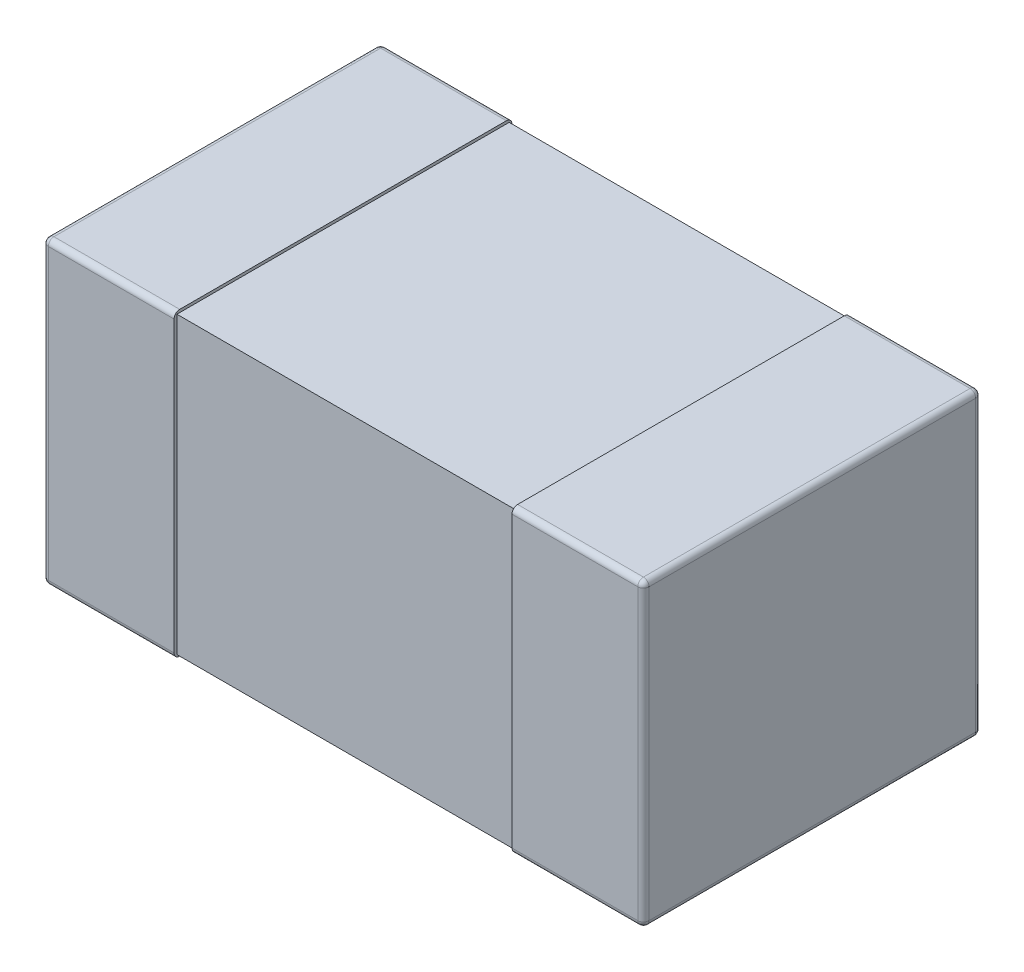
ISO-10303-21;
HEADER;
FILE_DESCRIPTION(('STEP AP214'),'2;1');
FILE_NAME('part.step','',(''),(''),'','','');
FILE_SCHEMA(('AUTOMOTIVE_DESIGN { 1 0 10303 214 1 1 1 1 }'));
ENDSEC;
DATA;
#1=APPLICATION_CONTEXT('core data for automotive mechanical design processes');
#2=APPLICATION_PROTOCOL_DEFINITION('international standard','automotive_design',2000,#1);
#3=PRODUCT_CONTEXT('',#1,'mechanical');
#4=PRODUCT('Part','Part','',(#3));
#5=PRODUCT_RELATED_PRODUCT_CATEGORY('part','',(#4));
#6=PRODUCT_DEFINITION_FORMATION('','',#4);
#7=PRODUCT_DEFINITION_CONTEXT('part definition',#1,'design');
#8=PRODUCT_DEFINITION('design','',#6,#7);
#9=PRODUCT_DEFINITION_SHAPE('','',#8);
#10=(LENGTH_UNIT() NAMED_UNIT(*) SI_UNIT(.MILLI.,.METRE.));
#11=(NAMED_UNIT(*) PLANE_ANGLE_UNIT() SI_UNIT($,.RADIAN.));
#12=(NAMED_UNIT(*) SI_UNIT($,.STERADIAN.) SOLID_ANGLE_UNIT());
#13=UNCERTAINTY_MEASURE_WITH_UNIT(LENGTH_MEASURE(1.E-05),#10,'distance_accuracy_value','');
#14=(GEOMETRIC_REPRESENTATION_CONTEXT(3) GLOBAL_UNCERTAINTY_ASSIGNED_CONTEXT((#13)) GLOBAL_UNIT_ASSIGNED_CONTEXT((#10,
#11,#12)) REPRESENTATION_CONTEXT('',''));
#15=CARTESIAN_POINT('',(0.,0.,0.));
#16=DIRECTION('',(0.,0.,1.));
#17=DIRECTION('',(1.,0.,0.));
#18=AXIS2_PLACEMENT_3D('',#15,#16,#17);
#19=CARTESIAN_POINT('',(-0.8,0.,0.));
#20=DIRECTION('',(-1.,0.,0.));
#21=DIRECTION('',(0.,0.,1.));
#22=AXIS2_PLACEMENT_3D('',#19,#20,#21);
#23=PLANE('',#22);
#24=DIRECTION('',(0.,1.,0.));
#25=VECTOR('',#24,1.);
#26=CARTESIAN_POINT('',(-0.8,0.,0.015));
#27=LINE('',#26,#25);
#28=CARTESIAN_POINT('',(-0.8,-0.385,0.0150000000000001));
#29=VERTEX_POINT('',#28);
#30=CARTESIAN_POINT('',(-0.8,0.385,0.0149999999999999));
#31=VERTEX_POINT('',#30);
#32=EDGE_CURVE('P0_E178',#29,#31,#27,.T.);
#33=ORIENTED_EDGE('',*,*,#32,.F.);
#34=DIRECTION('',(0.,0.,-1.));
#35=VECTOR('',#34,1.);
#36=CARTESIAN_POINT('',(-0.8,-0.385,0.));
#37=LINE('',#36,#35);
#38=CARTESIAN_POINT('',(-0.8,-0.385,0.885));
#39=VERTEX_POINT('',#38);
#40=EDGE_CURVE('P0_E108',#39,#29,#37,.T.);
#41=ORIENTED_EDGE('',*,*,#40,.F.);
#42=DIRECTION('',(0.,-1.,0.));
#43=VECTOR('',#42,1.);
#44=CARTESIAN_POINT('',(-0.8,0.,0.885));
#45=LINE('',#44,#43);
#46=CARTESIAN_POINT('',(-0.8,0.385,0.885));
#47=VERTEX_POINT('',#46);
#48=EDGE_CURVE('P0_E103',#47,#39,#45,.T.);
#49=ORIENTED_EDGE('',*,*,#48,.F.);
#50=DIRECTION('',(0.,0.,1.));
#51=VECTOR('',#50,1.);
#52=CARTESIAN_POINT('',(-0.8,0.385,0.));
#53=LINE('',#52,#51);
#54=EDGE_CURVE('P0_E106',#31,#47,#53,.T.);
#55=ORIENTED_EDGE('',*,*,#54,.F.);
#56=EDGE_LOOP('',(#33,#41,#49,#55));
#57=FACE_BOUND('',#56,.T.);
#58=ADVANCED_FACE('P0_F18',(#57),#23,.T.);
#59=CARTESIAN_POINT('',(-0.785,-0.385,0.885));
#60=DIRECTION('',(1.,0.,0.));
#61=DIRECTION('',(0.,0.,-1.));
#62=AXIS2_PLACEMENT_3D('',#59,#60,#61);
#63=SPHERICAL_SURFACE('',#62,0.015);
#64=CARTESIAN_POINT('',(-0.785,-0.385,0.885));
#65=DIRECTION('',(0.,-1.,0.));
#66=DIRECTION('',(0.,0.,-1.));
#67=AXIS2_PLACEMENT_3D('',#64,#65,#66);
#68=CIRCLE('',#67,0.015);
#69=CARTESIAN_POINT('',(-0.785,-0.385,0.9));
#70=VERTEX_POINT('',#69);
#71=EDGE_CURVE('P0_E112',#39,#70,#68,.F.);
#72=ORIENTED_EDGE('',*,*,#71,.F.);
#73=CARTESIAN_POINT('',(-0.785,-0.385,0.885));
#74=DIRECTION('',(0.,0.,-1.));
#75=DIRECTION('',(0.,1.,0.));
#76=AXIS2_PLACEMENT_3D('',#73,#74,#75);
#77=CIRCLE('',#76,0.015);
#78=CARTESIAN_POINT('',(-0.785,-0.4,0.885));
#79=VERTEX_POINT('',#78);
#80=EDGE_CURVE('P0_E175',#79,#39,#77,.T.);
#81=ORIENTED_EDGE('',*,*,#80,.F.);
#82=CARTESIAN_POINT('',(-0.785,-0.385,0.885));
#83=DIRECTION('',(1.,0.,0.));
#84=DIRECTION('',(0.,0.,-1.));
#85=AXIS2_PLACEMENT_3D('',#82,#83,#84);
#86=CIRCLE('',#85,0.015);
#87=EDGE_CURVE('P0_E256',#70,#79,#86,.T.);
#88=ORIENTED_EDGE('',*,*,#87,.F.);
#89=EDGE_LOOP('',(#72,#81,#88));
#90=FACE_BOUND('',#89,.T.);
#91=ADVANCED_FACE('P0_F164',(#90),#63,.T.);
#92=CARTESIAN_POINT('',(-0.785,0.,0.885));
#93=DIRECTION('',(0.,-1.,0.));
#94=DIRECTION('',(0.,0.,-1.));
#95=AXIS2_PLACEMENT_3D('',#92,#93,#94);
#96=CYLINDRICAL_SURFACE('',#95,0.015);
#97=ORIENTED_EDGE('',*,*,#71,.T.);
#98=DIRECTION('',(0.,1.,0.));
#99=VECTOR('',#98,1.);
#100=CARTESIAN_POINT('',(-0.785,0.4,0.9));
#101=LINE('',#100,#99);
#102=CARTESIAN_POINT('',(-0.785,0.385,0.9));
#103=VERTEX_POINT('',#102);
#104=EDGE_CURVE('P0_E118',#70,#103,#101,.T.);
#105=ORIENTED_EDGE('',*,*,#104,.T.);
#106=CARTESIAN_POINT('',(-0.785,0.385,0.885));
#107=DIRECTION('',(0.,-1.,0.));
#108=DIRECTION('',(1.,0.,0.));
#109=AXIS2_PLACEMENT_3D('',#106,#107,#108);
#110=CIRCLE('',#109,0.015);
#111=EDGE_CURVE('P0_E115',#47,#103,#110,.F.);
#112=ORIENTED_EDGE('',*,*,#111,.F.);
#113=ORIENTED_EDGE('',*,*,#48,.T.);
#114=EDGE_LOOP('',(#97,#105,#112,#113));
#115=FACE_BOUND('',#114,.T.);
#116=ADVANCED_FACE('P0_F116',(#115),#96,.T.);
#117=CARTESIAN_POINT('',(-0.785,0.385,0.885));
#118=DIRECTION('',(1.,0.,0.));
#119=DIRECTION('',(0.,0.,-1.));
#120=AXIS2_PLACEMENT_3D('',#117,#118,#119);
#121=SPHERICAL_SURFACE('',#120,0.015);
#122=CARTESIAN_POINT('',(-0.785,0.385,0.885));
#123=DIRECTION('',(1.,0.,0.));
#124=DIRECTION('',(0.,0.,-1.));
#125=AXIS2_PLACEMENT_3D('',#122,#123,#124);
#126=CIRCLE('',#125,0.015);
#127=CARTESIAN_POINT('',(-0.785,0.4,0.885));
#128=VERTEX_POINT('',#127);
#129=EDGE_CURVE('P0_E135',#128,#103,#126,.T.);
#130=ORIENTED_EDGE('',*,*,#129,.F.);
#131=CARTESIAN_POINT('',(-0.785,0.385,0.885));
#132=DIRECTION('',(0.,0.,1.));
#133=DIRECTION('',(1.,0.,0.));
#134=AXIS2_PLACEMENT_3D('',#131,#132,#133);
#135=CIRCLE('',#134,0.015);
#136=EDGE_CURVE('P0_E125',#47,#128,#135,.F.);
#137=ORIENTED_EDGE('',*,*,#136,.F.);
#138=ORIENTED_EDGE('',*,*,#111,.T.);
#139=EDGE_LOOP('',(#130,#137,#138));
#140=FACE_BOUND('',#139,.T.);
#141=ADVANCED_FACE('P0_F134',(#140),#121,.T.);
#142=CARTESIAN_POINT('',(-0.785,0.385,0.));
#143=DIRECTION('',(0.,0.,1.));
#144=DIRECTION('',(1.,0.,0.));
#145=AXIS2_PLACEMENT_3D('',#142,#143,#144);
#146=CYLINDRICAL_SURFACE('',#145,0.015);
#147=CARTESIAN_POINT('',(-0.785,0.385,0.0149999999999999));
#148=DIRECTION('',(0.,3.19361374222152E-13,1.));
#149=DIRECTION('',(1.,0.,0.));
#150=AXIS2_PLACEMENT_3D('',#147,#148,#149);
#151=CIRCLE('',#150,0.015);
#152=CARTESIAN_POINT('',(-0.785,0.4,0.0149999999999987));
#153=VERTEX_POINT('',#152);
#154=EDGE_CURVE('P0_E130',#31,#153,#151,.F.);
#155=ORIENTED_EDGE('',*,*,#154,.F.);
#156=ORIENTED_EDGE('',*,*,#54,.T.);
#157=ORIENTED_EDGE('',*,*,#136,.T.);
#158=DIRECTION('',(0.,0.,-1.));
#159=VECTOR('',#158,1.);
#160=CARTESIAN_POINT('',(-0.785,0.4,0.));
#161=LINE('',#160,#159);
#162=EDGE_CURVE('P0_E246',#128,#153,#161,.T.);
#163=ORIENTED_EDGE('',*,*,#162,.T.);
#164=EDGE_LOOP('',(#155,#156,#157,#163));
#165=FACE_BOUND('',#164,.T.);
#166=ADVANCED_FACE('P0_F128',(#165),#146,.T.);
#167=CARTESIAN_POINT('',(-0.785,0.385,0.0149999999999999));
#168=DIRECTION('',(1.,0.,0.));
#169=DIRECTION('',(0.,0.,-1.));
#170=AXIS2_PLACEMENT_3D('',#167,#168,#169);
#171=SPHERICAL_SURFACE('',#170,0.015);
#172=CARTESIAN_POINT('',(-0.785,0.385,0.0149999999999999));
#173=DIRECTION('',(1.,0.,0.));
#174=DIRECTION('',(0.,0.,-1.));
#175=AXIS2_PLACEMENT_3D('',#172,#173,#174);
#176=CIRCLE('',#175,0.015);
#177=CARTESIAN_POINT('',(-0.785,0.385,0.));
#178=VERTEX_POINT('',#177);
#179=EDGE_CURVE('P0_E240',#178,#153,#176,.T.);
#180=ORIENTED_EDGE('',*,*,#179,.F.);
#181=CARTESIAN_POINT('',(-0.785,0.385,0.0149999999999999));
#182=DIRECTION('',(0.,1.,0.));
#183=DIRECTION('',(0.,0.,1.));
#184=AXIS2_PLACEMENT_3D('',#181,#182,#183);
#185=CIRCLE('',#184,0.015);
#186=EDGE_CURVE('P0_E182',#31,#178,#185,.F.);
#187=ORIENTED_EDGE('',*,*,#186,.F.);
#188=ORIENTED_EDGE('',*,*,#154,.T.);
#189=EDGE_LOOP('',(#180,#187,#188));
#190=FACE_BOUND('',#189,.T.);
#191=ADVANCED_FACE('P0_F298',(#190),#171,.T.);
#192=CARTESIAN_POINT('',(-0.785,0.,0.015));
#193=DIRECTION('',(0.,1.,0.));
#194=DIRECTION('',(0.,0.,1.));
#195=AXIS2_PLACEMENT_3D('',#192,#193,#194);
#196=CYLINDRICAL_SURFACE('',#195,0.015);
#197=CARTESIAN_POINT('',(-0.785,-0.385,0.0150000000000001));
#198=DIRECTION('',(0.,1.,0.));
#199=DIRECTION('',(1.,0.,0.));
#200=AXIS2_PLACEMENT_3D('',#197,#198,#199);
#201=CIRCLE('',#200,0.015);
#202=CARTESIAN_POINT('',(-0.785,-0.385,0.));
#203=VERTEX_POINT('',#202);
#204=EDGE_CURVE('P0_E181',#29,#203,#201,.F.);
#205=ORIENTED_EDGE('',*,*,#204,.F.);
#206=ORIENTED_EDGE('',*,*,#32,.T.);
#207=ORIENTED_EDGE('',*,*,#186,.T.);
#208=DIRECTION('',(0.,-1.,0.));
#209=VECTOR('',#208,1.);
#210=CARTESIAN_POINT('',(-0.785,0.4,0.));
#211=LINE('',#210,#209);
#212=EDGE_CURVE('P0_E234',#178,#203,#211,.T.);
#213=ORIENTED_EDGE('',*,*,#212,.T.);
#214=EDGE_LOOP('',(#205,#206,#207,#213));
#215=FACE_BOUND('',#214,.T.);
#216=ADVANCED_FACE('P0_F294',(#215),#196,.T.);
#217=CARTESIAN_POINT('',(-0.785,-0.385,0.0150000000000001));
#218=DIRECTION('',(1.,0.,0.));
#219=DIRECTION('',(0.,0.,-1.));
#220=AXIS2_PLACEMENT_3D('',#217,#218,#219);
#221=SPHERICAL_SURFACE('',#220,0.015);
#222=ORIENTED_EDGE('',*,*,#204,.T.);
#223=CARTESIAN_POINT('',(-0.785,-0.385,0.0150000000000001));
#224=DIRECTION('',(1.,0.,0.));
#225=DIRECTION('',(0.,0.,-1.));
#226=AXIS2_PLACEMENT_3D('',#223,#224,#225);
#227=CIRCLE('',#226,0.015);
#228=CARTESIAN_POINT('',(-0.785,-0.4,0.0150000000000001));
#229=VERTEX_POINT('',#228);
#230=EDGE_CURVE('P0_E227',#229,#203,#227,.T.);
#231=ORIENTED_EDGE('',*,*,#230,.F.);
#232=CARTESIAN_POINT('',(-0.785,-0.385,0.0150000000000001));
#233=DIRECTION('',(0.,0.,-1.));
#234=DIRECTION('',(0.,1.,0.));
#235=AXIS2_PLACEMENT_3D('',#232,#233,#234);
#236=CIRCLE('',#235,0.015);
#237=EDGE_CURVE('P0_E68',#29,#229,#236,.F.);
#238=ORIENTED_EDGE('',*,*,#237,.F.);
#239=EDGE_LOOP('',(#222,#231,#238));
#240=FACE_BOUND('',#239,.T.);
#241=ADVANCED_FACE('P0_F289',(#240),#221,.T.);
#242=CARTESIAN_POINT('',(-0.785,-0.385,0.));
#243=DIRECTION('',(0.,0.,-1.));
#244=DIRECTION('',(0.,1.,0.));
#245=AXIS2_PLACEMENT_3D('',#242,#243,#244);
#246=CYLINDRICAL_SURFACE('',#245,0.015);
#247=ORIENTED_EDGE('',*,*,#237,.T.);
#248=DIRECTION('',(0.,0.,1.));
#249=VECTOR('',#248,1.);
#250=CARTESIAN_POINT('',(-0.785,-0.4,0.));
#251=LINE('',#250,#249);
#252=EDGE_CURVE('P0_E212',#229,#79,#251,.T.);
#253=ORIENTED_EDGE('',*,*,#252,.T.);
#254=ORIENTED_EDGE('',*,*,#80,.T.);
#255=ORIENTED_EDGE('',*,*,#40,.T.);
#256=EDGE_LOOP('',(#247,#253,#254,#255));
#257=FACE_BOUND('',#256,.T.);
#258=ADVANCED_FACE('P0_F293',(#257),#246,.T.);
#259=CARTESIAN_POINT('',(-0.8,-0.385,0.885));
#260=DIRECTION('',(1.,0.,0.));
#261=DIRECTION('',(0.,0.,-1.));
#262=AXIS2_PLACEMENT_3D('',#259,#260,#261);
#263=CYLINDRICAL_SURFACE('',#262,0.015);
#264=ORIENTED_EDGE('',*,*,#87,.T.);
#265=DIRECTION('',(1.,0.,0.));
#266=VECTOR('',#265,1.);
#267=CARTESIAN_POINT('',(-0.8,-0.4,0.885));
#268=LINE('',#267,#266);
#269=CARTESIAN_POINT('',(-0.45,-0.4,0.885));
#270=VERTEX_POINT('',#269);
#271=EDGE_CURVE('P0_E217',#79,#270,#268,.T.);
#272=ORIENTED_EDGE('',*,*,#271,.T.);
#273=CARTESIAN_POINT('',(-0.45,-0.385,0.885));
#274=DIRECTION('',(1.,0.,0.));
#275=DIRECTION('',(0.,0.,-1.));
#276=AXIS2_PLACEMENT_3D('',#273,#274,#275);
#277=CIRCLE('',#276,0.015);
#278=CARTESIAN_POINT('',(-0.45,-0.385,0.9));
#279=VERTEX_POINT('',#278);
#280=EDGE_CURVE('P0_E21',#270,#279,#277,.F.);
#281=ORIENTED_EDGE('',*,*,#280,.T.);
#282=DIRECTION('',(1.,0.,0.));
#283=VECTOR('',#282,1.);
#284=CARTESIAN_POINT('',(-0.8,-0.385,0.9));
#285=LINE('',#284,#283);
#286=EDGE_CURVE('P0_E153',#279,#70,#285,.F.);
#287=ORIENTED_EDGE('',*,*,#286,.T.);
#288=EDGE_LOOP('',(#264,#272,#281,#287));
#289=FACE_BOUND('',#288,.T.);
#290=ADVANCED_FACE('P0_F420',(#289),#263,.T.);
#291=CARTESIAN_POINT('',(-0.8,0.4,0.9));
#292=DIRECTION('',(0.,0.,-1.));
#293=DIRECTION('',(0.,1.,0.));
#294=AXIS2_PLACEMENT_3D('',#291,#292,#293);
#295=PLANE('',#294);
#296=DIRECTION('',(1.,0.,0.));
#297=VECTOR('',#296,1.);
#298=CARTESIAN_POINT('',(-0.8,0.385,0.9));
#299=LINE('',#298,#297);
#300=CARTESIAN_POINT('',(-0.45,0.385,0.9));
#301=VERTEX_POINT('',#300);
#302=EDGE_CURVE('P0_E148',#103,#301,#299,.T.);
#303=ORIENTED_EDGE('',*,*,#302,.F.);
#304=ORIENTED_EDGE('',*,*,#104,.F.);
#305=ORIENTED_EDGE('',*,*,#286,.F.);
#306=DIRECTION('',(0.,1.,0.));
#307=VECTOR('',#306,1.);
#308=CARTESIAN_POINT('',(-0.45,0.,0.9));
#309=LINE('',#308,#307);
#310=EDGE_CURVE('P0_E200',#279,#301,#309,.T.);
#311=ORIENTED_EDGE('',*,*,#310,.T.);
#312=EDGE_LOOP('',(#303,#304,#305,#311));
#313=FACE_BOUND('',#312,.T.);
#314=ADVANCED_FACE('P0_F411',(#313),#295,.F.);
#315=CARTESIAN_POINT('',(-0.8,0.385,0.885));
#316=DIRECTION('',(1.,0.,0.));
#317=DIRECTION('',(0.,0.,-1.));
#318=AXIS2_PLACEMENT_3D('',#315,#316,#317);
#319=CYLINDRICAL_SURFACE('',#318,0.015);
#320=CARTESIAN_POINT('',(-0.45,0.385,0.885));
#321=DIRECTION('',(1.,0.,0.));
#322=DIRECTION('',(0.,0.,-1.));
#323=AXIS2_PLACEMENT_3D('',#320,#321,#322);
#324=CIRCLE('',#323,0.015);
#325=CARTESIAN_POINT('',(-0.45,0.4,0.885));
#326=VERTEX_POINT('',#325);
#327=EDGE_CURVE('P0_E197',#301,#326,#324,.F.);
#328=ORIENTED_EDGE('',*,*,#327,.T.);
#329=DIRECTION('',(1.,0.,0.));
#330=VECTOR('',#329,1.);
#331=CARTESIAN_POINT('',(-0.8,0.4,0.885));
#332=LINE('',#331,#330);
#333=EDGE_CURVE('P0_E243',#326,#128,#332,.F.);
#334=ORIENTED_EDGE('',*,*,#333,.T.);
#335=ORIENTED_EDGE('',*,*,#129,.T.);
#336=ORIENTED_EDGE('',*,*,#302,.T.);
#337=EDGE_LOOP('',(#328,#334,#335,#336));
#338=FACE_BOUND('',#337,.T.);
#339=ADVANCED_FACE('P0_F402',(#338),#319,.T.);
#340=CARTESIAN_POINT('',(-0.8,0.4,0.));
#341=DIRECTION('',(0.,-1.,0.));
#342=DIRECTION('',(0.,0.,-1.));
#343=AXIS2_PLACEMENT_3D('',#340,#341,#342);
#344=PLANE('',#343);
#345=DIRECTION('',(1.,0.,0.));
#346=VECTOR('',#345,1.);
#347=CARTESIAN_POINT('',(-0.8,0.4,0.0149999999999999));
#348=LINE('',#347,#346);
#349=CARTESIAN_POINT('',(-0.45,0.4,0.0149999999999999));
#350=VERTEX_POINT('',#349);
#351=EDGE_CURVE('P0_E235',#153,#350,#348,.T.);
#352=ORIENTED_EDGE('',*,*,#351,.F.);
#353=ORIENTED_EDGE('',*,*,#162,.F.);
#354=ORIENTED_EDGE('',*,*,#333,.F.);
#355=DIRECTION('',(0.,0.,1.));
#356=VECTOR('',#355,1.);
#357=CARTESIAN_POINT('',(-0.45,0.4,0.));
#358=LINE('',#357,#356);
#359=EDGE_CURVE('P0_E196',#326,#350,#358,.F.);
#360=ORIENTED_EDGE('',*,*,#359,.T.);
#361=EDGE_LOOP('',(#352,#353,#354,#360));
#362=FACE_BOUND('',#361,.T.);
#363=ADVANCED_FACE('P0_F323',(#362),#344,.F.);
#364=CARTESIAN_POINT('',(-0.8,0.385,0.0149999999999999));
#365=DIRECTION('',(1.,0.,0.));
#366=DIRECTION('',(0.,0.,-1.));
#367=AXIS2_PLACEMENT_3D('',#364,#365,#366);
#368=CYLINDRICAL_SURFACE('',#367,0.015);
#369=ORIENTED_EDGE('',*,*,#179,.T.);
#370=ORIENTED_EDGE('',*,*,#351,.T.);
#371=CARTESIAN_POINT('',(-0.45,0.385,0.0149999999999999));
#372=DIRECTION('',(1.,0.,0.));
#373=DIRECTION('',(0.,0.,-1.));
#374=AXIS2_PLACEMENT_3D('',#371,#372,#373);
#375=CIRCLE('',#374,0.015);
#376=CARTESIAN_POINT('',(-0.45,0.385,0.));
#377=VERTEX_POINT('',#376);
#378=EDGE_CURVE('P0_E193',#350,#377,#375,.F.);
#379=ORIENTED_EDGE('',*,*,#378,.T.);
#380=DIRECTION('',(1.,0.,0.));
#381=VECTOR('',#380,1.);
#382=CARTESIAN_POINT('',(-0.8,0.385,0.));
#383=LINE('',#382,#381);
#384=EDGE_CURVE('P0_E230',#377,#178,#383,.F.);
#385=ORIENTED_EDGE('',*,*,#384,.T.);
#386=EDGE_LOOP('',(#369,#370,#379,#385));
#387=FACE_BOUND('',#386,.T.);
#388=ADVANCED_FACE('P0_F327',(#387),#368,.T.);
#389=CARTESIAN_POINT('',(-0.8,0.4,0.));
#390=DIRECTION('',(0.,0.,1.));
#391=DIRECTION('',(0.,-1.,0.));
#392=AXIS2_PLACEMENT_3D('',#389,#390,#391);
#393=PLANE('',#392);
#394=DIRECTION('',(1.,0.,0.));
#395=VECTOR('',#394,1.);
#396=CARTESIAN_POINT('',(-0.8,-0.385,0.));
#397=LINE('',#396,#395);
#398=CARTESIAN_POINT('',(-0.45,-0.385,0.));
#399=VERTEX_POINT('',#398);
#400=EDGE_CURVE('P0_E222',#203,#399,#397,.T.);
#401=ORIENTED_EDGE('',*,*,#400,.F.);
#402=ORIENTED_EDGE('',*,*,#212,.F.);
#403=ORIENTED_EDGE('',*,*,#384,.F.);
#404=DIRECTION('',(0.,1.,0.));
#405=VECTOR('',#404,1.);
#406=CARTESIAN_POINT('',(-0.45,0.,0.));
#407=LINE('',#406,#405);
#408=EDGE_CURVE('P0_E192',#377,#399,#407,.F.);
#409=ORIENTED_EDGE('',*,*,#408,.T.);
#410=EDGE_LOOP('',(#401,#402,#403,#409));
#411=FACE_BOUND('',#410,.T.);
#412=ADVANCED_FACE('P0_F337',(#411),#393,.F.);
#413=CARTESIAN_POINT('',(-0.8,-0.385,0.0150000000000001));
#414=DIRECTION('',(1.,0.,0.));
#415=DIRECTION('',(0.,0.,-1.));
#416=AXIS2_PLACEMENT_3D('',#413,#414,#415);
#417=CYLINDRICAL_SURFACE('',#416,0.015);
#418=CARTESIAN_POINT('',(-0.45,-0.385,0.0150000000000001));
#419=DIRECTION('',(1.,0.,0.));
#420=DIRECTION('',(0.,0.,-1.));
#421=AXIS2_PLACEMENT_3D('',#418,#419,#420);
#422=CIRCLE('',#421,0.015);
#423=CARTESIAN_POINT('',(-0.45,-0.4,0.0150000000000001));
#424=VERTEX_POINT('',#423);
#425=EDGE_CURVE('P0_E28',#399,#424,#422,.F.);
#426=ORIENTED_EDGE('',*,*,#425,.T.);
#427=DIRECTION('',(1.,0.,0.));
#428=VECTOR('',#427,1.);
#429=CARTESIAN_POINT('',(-0.8,-0.4,0.0150000000000001));
#430=LINE('',#429,#428);
#431=EDGE_CURVE('P0_E36',#424,#229,#430,.F.);
#432=ORIENTED_EDGE('',*,*,#431,.T.);
#433=ORIENTED_EDGE('',*,*,#230,.T.);
#434=ORIENTED_EDGE('',*,*,#400,.T.);
#435=EDGE_LOOP('',(#426,#432,#433,#434));
#436=FACE_BOUND('',#435,.T.);
#437=ADVANCED_FACE('P0_F345',(#436),#417,.T.);
#438=CARTESIAN_POINT('',(-0.8,-0.4,0.));
#439=DIRECTION('',(0.,1.,0.));
#440=DIRECTION('',(0.,0.,1.));
#441=AXIS2_PLACEMENT_3D('',#438,#439,#440);
#442=PLANE('',#441);
#443=ORIENTED_EDGE('',*,*,#431,.F.);
#444=DIRECTION('',(0.,0.,1.));
#445=VECTOR('',#444,1.);
#446=CARTESIAN_POINT('',(-0.45,-0.4,0.));
#447=LINE('',#446,#445);
#448=EDGE_CURVE('P0_E11',#424,#270,#447,.T.);
#449=ORIENTED_EDGE('',*,*,#448,.T.);
#450=ORIENTED_EDGE('',*,*,#271,.F.);
#451=ORIENTED_EDGE('',*,*,#252,.F.);
#452=EDGE_LOOP('',(#443,#449,#450,#451));
#453=FACE_BOUND('',#452,.T.);
#454=ADVANCED_FACE('P0_F343',(#453),#442,.F.);
#455=CARTESIAN_POINT('',(-0.45,0.,0.));
#456=DIRECTION('',(-1.,0.,0.));
#457=DIRECTION('',(0.,0.,1.));
#458=AXIS2_PLACEMENT_3D('',#455,#456,#457);
#459=PLANE('',#458);
#460=ORIENTED_EDGE('',*,*,#425,.F.);
#461=ORIENTED_EDGE('',*,*,#408,.F.);
#462=ORIENTED_EDGE('',*,*,#378,.F.);
#463=ORIENTED_EDGE('',*,*,#359,.F.);
#464=ORIENTED_EDGE('',*,*,#327,.F.);
#465=ORIENTED_EDGE('',*,*,#310,.F.);
#466=ORIENTED_EDGE('',*,*,#280,.F.);
#467=ORIENTED_EDGE('',*,*,#448,.F.);
#468=EDGE_LOOP('',(#460,#461,#462,#463,#464,#465,#466,#467));
#469=FACE_BOUND('',#468,.T.);
#470=ADVANCED_FACE('P0_F330',(#469),#459,.F.);
#471=CLOSED_SHELL('',(#58,#91,#116,#141,#166,#191,#216,#241,#258,#290,#314,#339,#363,#388,#412,
#437,#454,#470));
#472=MANIFOLD_SOLID_BREP('P0_B1',#471);
#473=CARTESIAN_POINT('',(-0.45,0.3925,0.));
#474=DIRECTION('',(0.,-1.,0.));
#475=DIRECTION('',(0.,0.,-1.));
#476=AXIS2_PLACEMENT_3D('',#473,#474,#475);
#477=PLANE('',#476);
#478=DIRECTION('',(-1.,0.,0.));
#479=VECTOR('',#478,1.);
#480=CARTESIAN_POINT('',(-0.45,0.3925,0.8925));
#481=LINE('',#480,#479);
#482=CARTESIAN_POINT('',(-0.45,0.3925,0.8925));
#483=VERTEX_POINT('',#482);
#484=CARTESIAN_POINT('',(0.45,0.3925,0.8925));
#485=VERTEX_POINT('',#484);
#486=EDGE_CURVE('P1_E53',#483,#485,#481,.F.);
#487=ORIENTED_EDGE('',*,*,#486,.T.);
#488=DIRECTION('',(0.,0.,1.));
#489=VECTOR('',#488,1.);
#490=CARTESIAN_POINT('',(0.45,0.3925,0.9));
#491=LINE('',#490,#489);
#492=CARTESIAN_POINT('',(0.45,0.3925,0.0075));
#493=VERTEX_POINT('',#492);
#494=EDGE_CURVE('P1_E68',#485,#493,#491,.F.);
#495=ORIENTED_EDGE('',*,*,#494,.T.);
#496=DIRECTION('',(1.,0.,0.));
#497=VECTOR('',#496,1.);
#498=CARTESIAN_POINT('',(-0.45,0.3925,0.0075));
#499=LINE('',#498,#497);
#500=CARTESIAN_POINT('',(-0.45,0.3925,0.0075));
#501=VERTEX_POINT('',#500);
#502=EDGE_CURVE('P1_E20',#493,#501,#499,.F.);
#503=ORIENTED_EDGE('',*,*,#502,.T.);
#504=DIRECTION('',(0.,0.,-1.));
#505=VECTOR('',#504,1.);
#506=CARTESIAN_POINT('',(-0.45,0.3925,0.9));
#507=LINE('',#506,#505);
#508=EDGE_CURVE('P1_E58',#501,#483,#507,.F.);
#509=ORIENTED_EDGE('',*,*,#508,.T.);
#510=EDGE_LOOP('',(#487,#495,#503,#509));
#511=FACE_BOUND('',#510,.T.);
#512=ADVANCED_FACE('P1_F17',(#511),#477,.F.);
#513=CARTESIAN_POINT('',(-0.45,0.4,0.0075));
#514=DIRECTION('',(0.,0.,1.));
#515=DIRECTION('',(1.,0.,0.));
#516=AXIS2_PLACEMENT_3D('',#513,#514,#515);
#517=PLANE('',#516);
#518=DIRECTION('',(1.,0.,0.));
#519=VECTOR('',#518,1.);
#520=CARTESIAN_POINT('',(-0.45,-0.3925,0.0075));
#521=LINE('',#520,#519);
#522=CARTESIAN_POINT('',(0.45,-0.3925,0.0075));
#523=VERTEX_POINT('',#522);
#524=CARTESIAN_POINT('',(-0.45,-0.3925,0.0075));
#525=VERTEX_POINT('',#524);
#526=EDGE_CURVE('P1_E74',#523,#525,#521,.F.);
#527=ORIENTED_EDGE('',*,*,#526,.T.);
#528=DIRECTION('',(0.,1.,0.));
#529=VECTOR('',#528,1.);
#530=CARTESIAN_POINT('',(-0.45,-0.4,0.00750000000000002));
#531=LINE('',#530,#529);
#532=EDGE_CURVE('P1_E63',#525,#501,#531,.T.);
#533=ORIENTED_EDGE('',*,*,#532,.T.);
#534=ORIENTED_EDGE('',*,*,#502,.F.);
#535=DIRECTION('',(0.,1.,0.));
#536=VECTOR('',#535,1.);
#537=CARTESIAN_POINT('',(0.45,-0.4,0.00750000000000002));
#538=LINE('',#537,#536);
#539=EDGE_CURVE('P1_E80',#493,#523,#538,.F.);
#540=ORIENTED_EDGE('',*,*,#539,.T.);
#541=EDGE_LOOP('',(#527,#533,#534,#540));
#542=FACE_BOUND('',#541,.T.);
#543=ADVANCED_FACE('P1_F73',(#542),#517,.F.);
#544=CARTESIAN_POINT('',(-0.45,-0.4,0.9));
#545=DIRECTION('',(1.,0.,0.));
#546=DIRECTION('',(0.,0.,-1.));
#547=AXIS2_PLACEMENT_3D('',#544,#545,#546);
#548=PLANE('',#547);
#549=DIRECTION('',(0.,0.,1.));
#550=VECTOR('',#549,1.);
#551=CARTESIAN_POINT('',(-0.45,-0.3925,0.));
#552=LINE('',#551,#550);
#553=CARTESIAN_POINT('',(-0.45,-0.3925,0.8925));
#554=VERTEX_POINT('',#553);
#555=EDGE_CURVE('P1_E84',#525,#554,#552,.T.);
#556=ORIENTED_EDGE('',*,*,#555,.T.);
#557=DIRECTION('',(0.,1.,0.));
#558=VECTOR('',#557,1.);
#559=CARTESIAN_POINT('',(-0.45,0.4,0.8925));
#560=LINE('',#559,#558);
#561=EDGE_CURVE('P1_E65',#554,#483,#560,.T.);
#562=ORIENTED_EDGE('',*,*,#561,.T.);
#563=ORIENTED_EDGE('',*,*,#508,.F.);
#564=ORIENTED_EDGE('',*,*,#532,.F.);
#565=EDGE_LOOP('',(#556,#562,#563,#564));
#566=FACE_BOUND('',#565,.T.);
#567=ADVANCED_FACE('P1_F61',(#566),#548,.F.);
#568=CARTESIAN_POINT('',(-0.45,0.4,0.8925));
#569=DIRECTION('',(0.,0.,-1.));
#570=DIRECTION('',(-1.,0.,0.));
#571=AXIS2_PLACEMENT_3D('',#568,#569,#570);
#572=PLANE('',#571);
#573=DIRECTION('',(1.,0.,0.));
#574=VECTOR('',#573,1.);
#575=CARTESIAN_POINT('',(-0.45,-0.3925,0.8925));
#576=LINE('',#575,#574);
#577=CARTESIAN_POINT('',(0.45,-0.3925,0.8925));
#578=VERTEX_POINT('',#577);
#579=EDGE_CURVE('P1_E26',#554,#578,#576,.T.);
#580=ORIENTED_EDGE('',*,*,#579,.T.);
#581=DIRECTION('',(0.,1.,0.));
#582=VECTOR('',#581,1.);
#583=CARTESIAN_POINT('',(0.45,-0.4,0.8925));
#584=LINE('',#583,#582);
#585=EDGE_CURVE('P1_E34',#578,#485,#584,.T.);
#586=ORIENTED_EDGE('',*,*,#585,.T.);
#587=ORIENTED_EDGE('',*,*,#486,.F.);
#588=ORIENTED_EDGE('',*,*,#561,.F.);
#589=EDGE_LOOP('',(#580,#586,#587,#588));
#590=FACE_BOUND('',#589,.T.);
#591=ADVANCED_FACE('P1_F88',(#590),#572,.F.);
#592=CARTESIAN_POINT('',(0.45,-0.4,0.9));
#593=DIRECTION('',(-1.,0.,0.));
#594=DIRECTION('',(0.,0.,1.));
#595=AXIS2_PLACEMENT_3D('',#592,#593,#594);
#596=PLANE('',#595);
#597=DIRECTION('',(0.,0.,1.));
#598=VECTOR('',#597,1.);
#599=CARTESIAN_POINT('',(0.45,-0.3925,0.));
#600=LINE('',#599,#598);
#601=EDGE_CURVE('P1_E11',#578,#523,#600,.F.);
#602=ORIENTED_EDGE('',*,*,#601,.T.);
#603=ORIENTED_EDGE('',*,*,#539,.F.);
#604=ORIENTED_EDGE('',*,*,#494,.F.);
#605=ORIENTED_EDGE('',*,*,#585,.F.);
#606=EDGE_LOOP('',(#602,#603,#604,#605));
#607=FACE_BOUND('',#606,.T.);
#608=ADVANCED_FACE('P1_F91',(#607),#596,.F.);
#609=CARTESIAN_POINT('',(-0.45,-0.3925,0.));
#610=DIRECTION('',(0.,1.,0.));
#611=DIRECTION('',(0.,0.,1.));
#612=AXIS2_PLACEMENT_3D('',#609,#610,#611);
#613=PLANE('',#612);
#614=ORIENTED_EDGE('',*,*,#579,.F.);
#615=ORIENTED_EDGE('',*,*,#555,.F.);
#616=ORIENTED_EDGE('',*,*,#526,.F.);
#617=ORIENTED_EDGE('',*,*,#601,.F.);
#618=EDGE_LOOP('',(#614,#615,#616,#617));
#619=FACE_BOUND('',#618,.T.);
#620=ADVANCED_FACE('P1_F90',(#619),#613,.F.);
#621=CLOSED_SHELL('',(#512,#543,#567,#591,#608,#620));
#622=MANIFOLD_SOLID_BREP('P1_B1',#621);
#623=CARTESIAN_POINT('',(0.8,0.,0.));
#624=DIRECTION('',(1.,0.,0.));
#625=DIRECTION('',(0.,0.,-1.));
#626=AXIS2_PLACEMENT_3D('',#623,#624,#625);
#627=PLANE('',#626);
#628=DIRECTION('',(0.,0.,-1.));
#629=VECTOR('',#628,1.);
#630=CARTESIAN_POINT('',(0.8,0.385,0.));
#631=LINE('',#630,#629);
#632=CARTESIAN_POINT('',(0.8,0.385,0.885));
#633=VERTEX_POINT('',#632);
#634=CARTESIAN_POINT('',(0.8,0.385,0.015));
#635=VERTEX_POINT('',#634);
#636=EDGE_CURVE('P2_E93',#633,#635,#631,.T.);
#637=ORIENTED_EDGE('',*,*,#636,.F.);
#638=DIRECTION('',(0.,1.,0.));
#639=VECTOR('',#638,1.);
#640=CARTESIAN_POINT('',(0.8,0.,0.885));
#641=LINE('',#640,#639);
#642=CARTESIAN_POINT('',(0.8,-0.385,0.885));
#643=VERTEX_POINT('',#642);
#644=EDGE_CURVE('P2_E96',#643,#633,#641,.T.);
#645=ORIENTED_EDGE('',*,*,#644,.F.);
#646=DIRECTION('',(0.,0.,1.));
#647=VECTOR('',#646,1.);
#648=CARTESIAN_POINT('',(0.8,-0.385,0.));
#649=LINE('',#648,#647);
#650=CARTESIAN_POINT('',(0.8,-0.385,0.0149999999999999));
#651=VERTEX_POINT('',#650);
#652=EDGE_CURVE('P2_E99',#651,#643,#649,.T.);
#653=ORIENTED_EDGE('',*,*,#652,.F.);
#654=DIRECTION('',(0.,-1.,0.));
#655=VECTOR('',#654,1.);
#656=CARTESIAN_POINT('',(0.8,0.,0.015));
#657=LINE('',#656,#655);
#658=EDGE_CURVE('P2_E116',#635,#651,#657,.T.);
#659=ORIENTED_EDGE('',*,*,#658,.F.);
#660=EDGE_LOOP('',(#637,#645,#653,#659));
#661=FACE_BOUND('',#660,.T.);
#662=ADVANCED_FACE('P2_F17',(#661),#627,.T.);
#663=CARTESIAN_POINT('',(0.785,0.385,0.015));
#664=DIRECTION('',(1.,0.,0.));
#665=DIRECTION('',(0.,0.,-1.));
#666=AXIS2_PLACEMENT_3D('',#663,#664,#665);
#667=SPHERICAL_SURFACE('',#666,0.015);
#668=CARTESIAN_POINT('',(0.785,0.385,0.015));
#669=DIRECTION('',(0.,0.,-1.));
#670=DIRECTION('',(-1.,0.,0.));
#671=AXIS2_PLACEMENT_3D('',#668,#669,#670);
#672=CIRCLE('',#671,0.015);
#673=CARTESIAN_POINT('',(0.785,0.4,0.015));
#674=VERTEX_POINT('',#673);
#675=EDGE_CURVE('P2_E263',#635,#674,#672,.F.);
#676=ORIENTED_EDGE('',*,*,#675,.F.);
#677=CARTESIAN_POINT('',(0.785,0.385,0.015));
#678=DIRECTION('',(0.,-1.,0.));
#679=DIRECTION('',(0.,0.,-1.));
#680=AXIS2_PLACEMENT_3D('',#677,#678,#679);
#681=CIRCLE('',#680,0.015);
#682=CARTESIAN_POINT('',(0.785,0.385,0.));
#683=VERTEX_POINT('',#682);
#684=EDGE_CURVE('P2_E188',#683,#635,#681,.T.);
#685=ORIENTED_EDGE('',*,*,#684,.F.);
#686=CARTESIAN_POINT('',(0.785,0.385,0.015));
#687=DIRECTION('',(-1.,0.,0.));
#688=DIRECTION('',(0.,0.,1.));
#689=AXIS2_PLACEMENT_3D('',#686,#687,#688);
#690=CIRCLE('',#689,0.015);
#691=EDGE_CURVE('P2_E119',#674,#683,#690,.T.);
#692=ORIENTED_EDGE('',*,*,#691,.F.);
#693=EDGE_LOOP('',(#676,#685,#692));
#694=FACE_BOUND('',#693,.T.);
#695=ADVANCED_FACE('P2_F243',(#694),#667,.T.);
#696=CARTESIAN_POINT('',(0.785,0.385,0.));
#697=DIRECTION('',(0.,0.,-1.));
#698=DIRECTION('',(-1.,0.,0.));
#699=AXIS2_PLACEMENT_3D('',#696,#697,#698);
#700=CYLINDRICAL_SURFACE('',#699,0.015);
#701=ORIENTED_EDGE('',*,*,#675,.T.);
#702=DIRECTION('',(0.,0.,-1.));
#703=VECTOR('',#702,1.);
#704=CARTESIAN_POINT('',(0.785,0.4,0.9));
#705=LINE('',#704,#703);
#706=CARTESIAN_POINT('',(0.785,0.4,0.885));
#707=VERTEX_POINT('',#706);
#708=EDGE_CURVE('P2_E176',#674,#707,#705,.F.);
#709=ORIENTED_EDGE('',*,*,#708,.T.);
#710=CARTESIAN_POINT('',(0.785,0.385,0.885));
#711=DIRECTION('',(0.,0.,1.));
#712=DIRECTION('',(1.,0.,0.));
#713=AXIS2_PLACEMENT_3D('',#710,#711,#712);
#714=CIRCLE('',#713,0.015);
#715=EDGE_CURVE('P2_E223',#633,#707,#714,.T.);
#716=ORIENTED_EDGE('',*,*,#715,.F.);
#717=ORIENTED_EDGE('',*,*,#636,.T.);
#718=EDGE_LOOP('',(#701,#709,#716,#717));
#719=FACE_BOUND('',#718,.T.);
#720=ADVANCED_FACE('P2_F240',(#719),#700,.T.);
#721=CARTESIAN_POINT('',(0.785,0.385,0.885));
#722=DIRECTION('',(1.,0.,0.));
#723=DIRECTION('',(0.,0.,-1.));
#724=AXIS2_PLACEMENT_3D('',#721,#722,#723);
#725=SPHERICAL_SURFACE('',#724,0.015);
#726=CARTESIAN_POINT('',(0.785,0.385,0.885));
#727=DIRECTION('',(-1.,0.,0.));
#728=DIRECTION('',(0.,0.,1.));
#729=AXIS2_PLACEMENT_3D('',#726,#727,#728);
#730=CIRCLE('',#729,0.015);
#731=CARTESIAN_POINT('',(0.785,0.385,0.9));
#732=VERTEX_POINT('',#731);
#733=EDGE_CURVE('P2_E170',#732,#707,#730,.T.);
#734=ORIENTED_EDGE('',*,*,#733,.F.);
#735=CARTESIAN_POINT('',(0.785,0.385,0.885));
#736=DIRECTION('',(0.,1.,0.));
#737=DIRECTION('',(0.,0.,1.));
#738=AXIS2_PLACEMENT_3D('',#735,#736,#737);
#739=CIRCLE('',#738,0.015);
#740=EDGE_CURVE('P2_E75',#633,#732,#739,.F.);
#741=ORIENTED_EDGE('',*,*,#740,.F.);
#742=ORIENTED_EDGE('',*,*,#715,.T.);
#743=EDGE_LOOP('',(#734,#741,#742));
#744=FACE_BOUND('',#743,.T.);
#745=ADVANCED_FACE('P2_F237',(#744),#725,.T.);
#746=CARTESIAN_POINT('',(0.785,0.,0.885));
#747=DIRECTION('',(0.,1.,0.));
#748=DIRECTION('',(0.,0.,1.));
#749=AXIS2_PLACEMENT_3D('',#746,#747,#748);
#750=CYLINDRICAL_SURFACE('',#749,0.015);
#751=CARTESIAN_POINT('',(0.785,-0.385,0.885));
#752=DIRECTION('',(0.,-1.,0.));
#753=DIRECTION('',(1.,0.,0.));
#754=AXIS2_PLACEMENT_3D('',#751,#752,#753);
#755=CIRCLE('',#754,0.015);
#756=CARTESIAN_POINT('',(0.785,-0.385,0.9));
#757=VERTEX_POINT('',#756);
#758=EDGE_CURVE('P2_E63',#643,#757,#755,.T.);
#759=ORIENTED_EDGE('',*,*,#758,.F.);
#760=ORIENTED_EDGE('',*,*,#644,.T.);
#761=ORIENTED_EDGE('',*,*,#740,.T.);
#762=DIRECTION('',(0.,1.,0.));
#763=VECTOR('',#762,1.);
#764=CARTESIAN_POINT('',(0.785,0.4,0.9));
#765=LINE('',#764,#763);
#766=EDGE_CURVE('P2_E160',#732,#757,#765,.F.);
#767=ORIENTED_EDGE('',*,*,#766,.T.);
#768=EDGE_LOOP('',(#759,#760,#761,#767));
#769=FACE_BOUND('',#768,.T.);
#770=ADVANCED_FACE('P2_F211',(#769),#750,.T.);
#771=CARTESIAN_POINT('',(0.785,-0.385,0.885));
#772=DIRECTION('',(1.,0.,0.));
#773=DIRECTION('',(0.,0.,-1.));
#774=AXIS2_PLACEMENT_3D('',#771,#772,#773);
#775=SPHERICAL_SURFACE('',#774,0.015);
#776=CARTESIAN_POINT('',(0.785,-0.385,0.885));
#777=DIRECTION('',(-1.,0.,0.));
#778=DIRECTION('',(0.,0.,1.));
#779=AXIS2_PLACEMENT_3D('',#776,#777,#778);
#780=CIRCLE('',#779,0.015);
#781=CARTESIAN_POINT('',(0.785,-0.4,0.885));
#782=VERTEX_POINT('',#781);
#783=EDGE_CURVE('P2_E158',#782,#757,#780,.T.);
#784=ORIENTED_EDGE('',*,*,#783,.F.);
#785=CARTESIAN_POINT('',(0.785,-0.385,0.885));
#786=DIRECTION('',(0.,0.,1.));
#787=DIRECTION('',(0.,-1.,0.));
#788=AXIS2_PLACEMENT_3D('',#785,#786,#787);
#789=CIRCLE('',#788,0.015);
#790=EDGE_CURVE('P2_E219',#643,#782,#789,.F.);
#791=ORIENTED_EDGE('',*,*,#790,.F.);
#792=ORIENTED_EDGE('',*,*,#758,.T.);
#793=EDGE_LOOP('',(#784,#791,#792));
#794=FACE_BOUND('',#793,.T.);
#795=ADVANCED_FACE('P2_F206',(#794),#775,.T.);
#796=CARTESIAN_POINT('',(0.785,-0.385,0.));
#797=DIRECTION('',(0.,0.,1.));
#798=DIRECTION('',(0.,-1.,0.));
#799=AXIS2_PLACEMENT_3D('',#796,#797,#798);
#800=CYLINDRICAL_SURFACE('',#799,0.015);
#801=CARTESIAN_POINT('',(0.785,-0.385,0.0149999999999999));
#802=DIRECTION('',(0.,1.5968841852615E-13,-1.));
#803=DIRECTION('',(1.,0.,0.));
#804=AXIS2_PLACEMENT_3D('',#801,#802,#803);
#805=CIRCLE('',#804,0.015);
#806=CARTESIAN_POINT('',(0.785,-0.4,0.0149999999999993));
#807=VERTEX_POINT('',#806);
#808=EDGE_CURVE('P2_E124',#651,#807,#805,.T.);
#809=ORIENTED_EDGE('',*,*,#808,.F.);
#810=ORIENTED_EDGE('',*,*,#652,.T.);
#811=ORIENTED_EDGE('',*,*,#790,.T.);
#812=DIRECTION('',(0.,0.,1.));
#813=VECTOR('',#812,1.);
#814=CARTESIAN_POINT('',(0.785,-0.4,0.9));
#815=LINE('',#814,#813);
#816=EDGE_CURVE('P2_E128',#782,#807,#815,.F.);
#817=ORIENTED_EDGE('',*,*,#816,.T.);
#818=EDGE_LOOP('',(#809,#810,#811,#817));
#819=FACE_BOUND('',#818,.T.);
#820=ADVANCED_FACE('P2_F202',(#819),#800,.T.);
#821=CARTESIAN_POINT('',(0.785,-0.385,0.0149999999999999));
#822=DIRECTION('',(1.,0.,0.));
#823=DIRECTION('',(0.,0.,-1.));
#824=AXIS2_PLACEMENT_3D('',#821,#822,#823);
#825=SPHERICAL_SURFACE('',#824,0.015);
#826=ORIENTED_EDGE('',*,*,#808,.T.);
#827=CARTESIAN_POINT('',(0.785,-0.385,0.0149999999999999));
#828=DIRECTION('',(-1.,0.,0.));
#829=DIRECTION('',(0.,0.,1.));
#830=AXIS2_PLACEMENT_3D('',#827,#828,#829);
#831=CIRCLE('',#830,0.015);
#832=CARTESIAN_POINT('',(0.785,-0.385,0.));
#833=VERTEX_POINT('',#832);
#834=EDGE_CURVE('P2_E122',#833,#807,#831,.T.);
#835=ORIENTED_EDGE('',*,*,#834,.F.);
#836=CARTESIAN_POINT('',(0.785,-0.385,0.0149999999999999));
#837=DIRECTION('',(0.,-1.,0.));
#838=DIRECTION('',(0.,0.,-1.));
#839=AXIS2_PLACEMENT_3D('',#836,#837,#838);
#840=CIRCLE('',#839,0.015);
#841=EDGE_CURVE('P2_E111',#651,#833,#840,.F.);
#842=ORIENTED_EDGE('',*,*,#841,.F.);
#843=EDGE_LOOP('',(#826,#835,#842));
#844=FACE_BOUND('',#843,.T.);
#845=ADVANCED_FACE('P2_F123',(#844),#825,.T.);
#846=CARTESIAN_POINT('',(0.785,0.,0.015));
#847=DIRECTION('',(0.,-1.,0.));
#848=DIRECTION('',(0.,0.,-1.));
#849=AXIS2_PLACEMENT_3D('',#846,#847,#848);
#850=CYLINDRICAL_SURFACE('',#849,0.015);
#851=ORIENTED_EDGE('',*,*,#841,.T.);
#852=DIRECTION('',(0.,-1.,0.));
#853=VECTOR('',#852,1.);
#854=CARTESIAN_POINT('',(0.785,0.4,0.));
#855=LINE('',#854,#853);
#856=EDGE_CURVE('P2_E115',#833,#683,#855,.F.);
#857=ORIENTED_EDGE('',*,*,#856,.T.);
#858=ORIENTED_EDGE('',*,*,#684,.T.);
#859=ORIENTED_EDGE('',*,*,#658,.T.);
#860=EDGE_LOOP('',(#851,#857,#858,#859));
#861=FACE_BOUND('',#860,.T.);
#862=ADVANCED_FACE('P2_F113',(#861),#850,.T.);
#863=CARTESIAN_POINT('',(0.8,0.385,0.015));
#864=DIRECTION('',(-1.,0.,0.));
#865=DIRECTION('',(0.,0.,1.));
#866=AXIS2_PLACEMENT_3D('',#863,#864,#865);
#867=CYLINDRICAL_SURFACE('',#866,0.015);
#868=ORIENTED_EDGE('',*,*,#691,.T.);
#869=DIRECTION('',(1.,0.,0.));
#870=VECTOR('',#869,1.);
#871=CARTESIAN_POINT('',(0.8,0.385,0.));
#872=LINE('',#871,#870);
#873=CARTESIAN_POINT('',(0.45,0.385,0.));
#874=VERTEX_POINT('',#873);
#875=EDGE_CURVE('P2_E133',#683,#874,#872,.F.);
#876=ORIENTED_EDGE('',*,*,#875,.T.);
#877=CARTESIAN_POINT('',(0.45,0.385,0.015));
#878=DIRECTION('',(-1.,0.,0.));
#879=DIRECTION('',(0.,0.,1.));
#880=AXIS2_PLACEMENT_3D('',#877,#878,#879);
#881=CIRCLE('',#880,0.015);
#882=CARTESIAN_POINT('',(0.45,0.4,0.015));
#883=VERTEX_POINT('',#882);
#884=EDGE_CURVE('P2_E135',#874,#883,#881,.F.);
#885=ORIENTED_EDGE('',*,*,#884,.T.);
#886=DIRECTION('',(1.,0.,0.));
#887=VECTOR('',#886,1.);
#888=CARTESIAN_POINT('',(0.8,0.4,0.015));
#889=LINE('',#888,#887);
#890=EDGE_CURVE('P2_E173',#883,#674,#889,.T.);
#891=ORIENTED_EDGE('',*,*,#890,.T.);
#892=EDGE_LOOP('',(#868,#876,#885,#891));
#893=FACE_BOUND('',#892,.T.);
#894=ADVANCED_FACE('P2_F293',(#893),#867,.T.);
#895=CARTESIAN_POINT('',(0.8,0.4,0.9));
#896=DIRECTION('',(0.,-1.,0.));
#897=DIRECTION('',(0.,0.,-1.));
#898=AXIS2_PLACEMENT_3D('',#895,#896,#897);
#899=PLANE('',#898);
#900=ORIENTED_EDGE('',*,*,#890,.F.);
#901=DIRECTION('',(0.,0.,-1.));
#902=VECTOR('',#901,1.);
#903=CARTESIAN_POINT('',(0.45,0.4,0.));
#904=LINE('',#903,#902);
#905=CARTESIAN_POINT('',(0.45,0.4,0.885));
#906=VERTEX_POINT('',#905);
#907=EDGE_CURVE('P2_E144',#883,#906,#904,.F.);
#908=ORIENTED_EDGE('',*,*,#907,.T.);
#909=DIRECTION('',(-1.,0.,0.));
#910=VECTOR('',#909,1.);
#911=CARTESIAN_POINT('',(0.8,0.4,0.885));
#912=LINE('',#911,#910);
#913=EDGE_CURVE('P2_E166',#707,#906,#912,.T.);
#914=ORIENTED_EDGE('',*,*,#913,.F.);
#915=ORIENTED_EDGE('',*,*,#708,.F.);
#916=EDGE_LOOP('',(#900,#908,#914,#915));
#917=FACE_BOUND('',#916,.T.);
#918=ADVANCED_FACE('P2_F280',(#917),#899,.F.);
#919=CARTESIAN_POINT('',(0.8,0.385,0.885));
#920=DIRECTION('',(-1.,0.,0.));
#921=DIRECTION('',(0.,0.,1.));
#922=AXIS2_PLACEMENT_3D('',#919,#920,#921);
#923=CYLINDRICAL_SURFACE('',#922,0.015);
#924=CARTESIAN_POINT('',(0.45,0.385,0.885));
#925=DIRECTION('',(-1.,0.,0.));
#926=DIRECTION('',(0.,0.,1.));
#927=AXIS2_PLACEMENT_3D('',#924,#925,#926);
#928=CIRCLE('',#927,0.015);
#929=CARTESIAN_POINT('',(0.45,0.385,0.9));
#930=VERTEX_POINT('',#929);
#931=EDGE_CURVE('P2_E272',#906,#930,#928,.F.);
#932=ORIENTED_EDGE('',*,*,#931,.T.);
#933=DIRECTION('',(1.,0.,0.));
#934=VECTOR('',#933,1.);
#935=CARTESIAN_POINT('',(0.8,0.385,0.9));
#936=LINE('',#935,#934);
#937=EDGE_CURVE('P2_E163',#930,#732,#936,.T.);
#938=ORIENTED_EDGE('',*,*,#937,.T.);
#939=ORIENTED_EDGE('',*,*,#733,.T.);
#940=ORIENTED_EDGE('',*,*,#913,.T.);
#941=EDGE_LOOP('',(#932,#938,#939,#940));
#942=FACE_BOUND('',#941,.T.);
#943=ADVANCED_FACE('P2_F289',(#942),#923,.T.);
#944=CARTESIAN_POINT('',(0.8,0.4,0.9));
#945=DIRECTION('',(0.,0.,-1.));
#946=DIRECTION('',(0.,1.,0.));
#947=AXIS2_PLACEMENT_3D('',#944,#945,#946);
#948=PLANE('',#947);
#949=ORIENTED_EDGE('',*,*,#937,.F.);
#950=DIRECTION('',(0.,1.,0.));
#951=VECTOR('',#950,1.);
#952=CARTESIAN_POINT('',(0.45,0.,0.9));
#953=LINE('',#952,#951);
#954=CARTESIAN_POINT('',(0.45,-0.385,0.9));
#955=VERTEX_POINT('',#954);
#956=EDGE_CURVE('P2_E271',#930,#955,#953,.F.);
#957=ORIENTED_EDGE('',*,*,#956,.T.);
#958=DIRECTION('',(1.,0.,0.));
#959=VECTOR('',#958,1.);
#960=CARTESIAN_POINT('',(0.8,-0.385,0.9));
#961=LINE('',#960,#959);
#962=EDGE_CURVE('P2_E20',#757,#955,#961,.F.);
#963=ORIENTED_EDGE('',*,*,#962,.F.);
#964=ORIENTED_EDGE('',*,*,#766,.F.);
#965=EDGE_LOOP('',(#949,#957,#963,#964));
#966=FACE_BOUND('',#965,.T.);
#967=ADVANCED_FACE('P2_F304',(#966),#948,.F.);
#968=CARTESIAN_POINT('',(0.8,-0.385,0.885));
#969=DIRECTION('',(-1.,0.,0.));
#970=DIRECTION('',(0.,0.,1.));
#971=AXIS2_PLACEMENT_3D('',#968,#969,#970);
#972=CYLINDRICAL_SURFACE('',#971,0.015);
#973=ORIENTED_EDGE('',*,*,#783,.T.);
#974=ORIENTED_EDGE('',*,*,#962,.T.);
#975=CARTESIAN_POINT('',(0.45,-0.385,0.885));
#976=DIRECTION('',(-1.,0.,0.));
#977=DIRECTION('',(0.,0.,1.));
#978=AXIS2_PLACEMENT_3D('',#975,#976,#977);
#979=CIRCLE('',#978,0.015);
#980=CARTESIAN_POINT('',(0.45,-0.4,0.885));
#981=VERTEX_POINT('',#980);
#982=EDGE_CURVE('P2_E268',#955,#981,#979,.F.);
#983=ORIENTED_EDGE('',*,*,#982,.T.);
#984=DIRECTION('',(1.,0.,0.));
#985=VECTOR('',#984,1.);
#986=CARTESIAN_POINT('',(0.8,-0.4,0.885));
#987=LINE('',#986,#985);
#988=EDGE_CURVE('P2_E153',#981,#782,#987,.T.);
#989=ORIENTED_EDGE('',*,*,#988,.T.);
#990=EDGE_LOOP('',(#973,#974,#983,#989));
#991=FACE_BOUND('',#990,.T.);
#992=ADVANCED_FACE('P2_F307',(#991),#972,.T.);
#993=CARTESIAN_POINT('',(0.8,-0.4,0.9));
#994=DIRECTION('',(0.,1.,0.));
#995=DIRECTION('',(0.,0.,1.));
#996=AXIS2_PLACEMENT_3D('',#993,#994,#995);
#997=PLANE('',#996);
#998=DIRECTION('',(-1.,0.,0.));
#999=VECTOR('',#998,1.);
#1000=CARTESIAN_POINT('',(0.8,-0.4,0.0149999999999999));
#1001=LINE('',#1000,#999);
#1002=CARTESIAN_POINT('',(0.45,-0.4,0.0149999999999999));
#1003=VERTEX_POINT('',#1002);
#1004=EDGE_CURVE('P2_E127',#807,#1003,#1001,.T.);
#1005=ORIENTED_EDGE('',*,*,#1004,.F.);
#1006=ORIENTED_EDGE('',*,*,#816,.F.);
#1007=ORIENTED_EDGE('',*,*,#988,.F.);
#1008=DIRECTION('',(0.,0.,-1.));
#1009=VECTOR('',#1008,1.);
#1010=CARTESIAN_POINT('',(0.45,-0.4,0.));
#1011=LINE('',#1010,#1009);
#1012=EDGE_CURVE('P2_E267',#981,#1003,#1011,.T.);
#1013=ORIENTED_EDGE('',*,*,#1012,.T.);
#1014=EDGE_LOOP('',(#1005,#1006,#1007,#1013));
#1015=FACE_BOUND('',#1014,.T.);
#1016=ADVANCED_FACE('P2_F299',(#1015),#997,.F.);
#1017=CARTESIAN_POINT('',(0.8,-0.385,0.0149999999999999));
#1018=DIRECTION('',(-1.,0.,0.));
#1019=DIRECTION('',(0.,0.,1.));
#1020=AXIS2_PLACEMENT_3D('',#1017,#1018,#1019);
#1021=CYLINDRICAL_SURFACE('',#1020,0.015);
#1022=CARTESIAN_POINT('',(0.45,-0.385,0.0149999999999999));
#1023=DIRECTION('',(-1.,0.,0.));
#1024=DIRECTION('',(0.,0.,1.));
#1025=AXIS2_PLACEMENT_3D('',#1022,#1023,#1024);
#1026=CIRCLE('',#1025,0.015);
#1027=CARTESIAN_POINT('',(0.45,-0.385,0.));
#1028=VERTEX_POINT('',#1027);
#1029=EDGE_CURVE('P2_E26',#1003,#1028,#1026,.F.);
#1030=ORIENTED_EDGE('',*,*,#1029,.T.);
#1031=DIRECTION('',(1.,0.,0.));
#1032=VECTOR('',#1031,1.);
#1033=CARTESIAN_POINT('',(0.8,-0.385,0.));
#1034=LINE('',#1033,#1032);
#1035=EDGE_CURVE('P2_E34',#1028,#833,#1034,.T.);
#1036=ORIENTED_EDGE('',*,*,#1035,.T.);
#1037=ORIENTED_EDGE('',*,*,#834,.T.);
#1038=ORIENTED_EDGE('',*,*,#1004,.T.);
#1039=EDGE_LOOP('',(#1030,#1036,#1037,#1038));
#1040=FACE_BOUND('',#1039,.T.);
#1041=ADVANCED_FACE('P2_F138',(#1040),#1021,.T.);
#1042=CARTESIAN_POINT('',(0.8,0.4,0.));
#1043=DIRECTION('',(0.,0.,1.));
#1044=DIRECTION('',(0.,-1.,0.));
#1045=AXIS2_PLACEMENT_3D('',#1042,#1043,#1044);
#1046=PLANE('',#1045);
#1047=ORIENTED_EDGE('',*,*,#1035,.F.);
#1048=DIRECTION('',(0.,1.,0.));
#1049=VECTOR('',#1048,1.);
#1050=CARTESIAN_POINT('',(0.45,0.,0.));
#1051=LINE('',#1050,#1049);
#1052=EDGE_CURVE('P2_E11',#1028,#874,#1051,.T.);
#1053=ORIENTED_EDGE('',*,*,#1052,.T.);
#1054=ORIENTED_EDGE('',*,*,#875,.F.);
#1055=ORIENTED_EDGE('',*,*,#856,.F.);
#1056=EDGE_LOOP('',(#1047,#1053,#1054,#1055));
#1057=FACE_BOUND('',#1056,.T.);
#1058=ADVANCED_FACE('P2_F131',(#1057),#1046,.F.);
#1059=CARTESIAN_POINT('',(0.45,0.,0.));
#1060=DIRECTION('',(1.,0.,0.));
#1061=DIRECTION('',(0.,0.,-1.));
#1062=AXIS2_PLACEMENT_3D('',#1059,#1060,#1061);
#1063=PLANE('',#1062);
#1064=ORIENTED_EDGE('',*,*,#1029,.F.);
#1065=ORIENTED_EDGE('',*,*,#1012,.F.);
#1066=ORIENTED_EDGE('',*,*,#982,.F.);
#1067=ORIENTED_EDGE('',*,*,#956,.F.);
#1068=ORIENTED_EDGE('',*,*,#931,.F.);
#1069=ORIENTED_EDGE('',*,*,#907,.F.);
#1070=ORIENTED_EDGE('',*,*,#884,.F.);
#1071=ORIENTED_EDGE('',*,*,#1052,.F.);
#1072=EDGE_LOOP('',(#1064,#1065,#1066,#1067,#1068,#1069,#1070,#1071));
#1073=FACE_BOUND('',#1072,.T.);
#1074=ADVANCED_FACE('P2_F284',(#1073),#1063,.F.);
#1075=CLOSED_SHELL('',(#662,#695,#720,#745,#770,#795,#820,#845,#862,#894,#918,#943,#967,#992,
#1016,#1041,#1058,#1074));
#1076=MANIFOLD_SOLID_BREP('P2_B1',#1075);
#1077=ADVANCED_BREP_SHAPE_REPRESENTATION('',(#18,#472,#622,#1076),#14);
#1078=SHAPE_DEFINITION_REPRESENTATION(#9,#1077);
ENDSEC;
END-ISO-10303-21;
